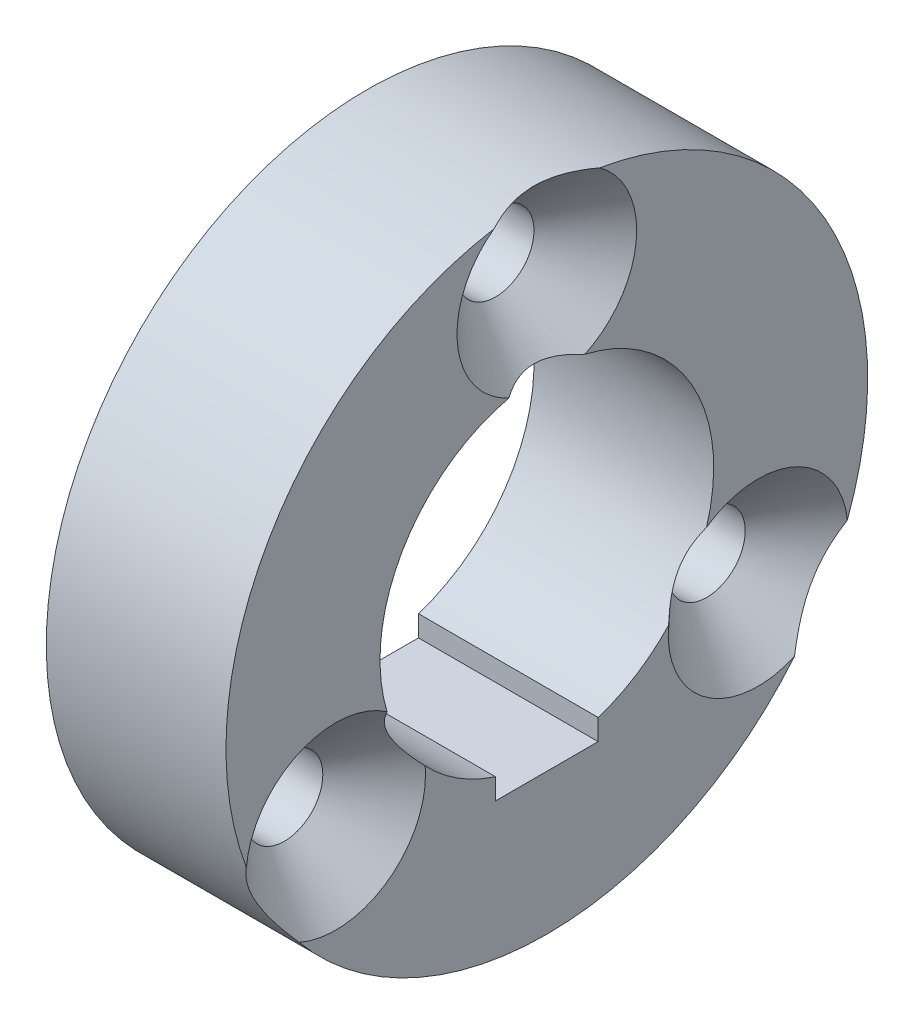
ISO-10303-21;
HEADER;
FILE_DESCRIPTION(('STEP AP214'),'2;1');
FILE_NAME('part.step','',(''),(''),'','','');
FILE_SCHEMA(('AUTOMOTIVE_DESIGN { 1 0 10303 214 1 1 1 1 }'));
ENDSEC;
DATA;
#1=APPLICATION_CONTEXT('core data for automotive mechanical design processes');
#2=APPLICATION_PROTOCOL_DEFINITION('international standard','automotive_design',2000,#1);
#3=PRODUCT_CONTEXT('',#1,'mechanical');
#4=PRODUCT('Part','Part','',(#3));
#5=PRODUCT_RELATED_PRODUCT_CATEGORY('part','',(#4));
#6=PRODUCT_DEFINITION_FORMATION('','',#4);
#7=PRODUCT_DEFINITION_CONTEXT('part definition',#1,'design');
#8=PRODUCT_DEFINITION('design','',#6,#7);
#9=PRODUCT_DEFINITION_SHAPE('','',#8);
#10=(LENGTH_UNIT() NAMED_UNIT(*) SI_UNIT(.MILLI.,.METRE.));
#11=(NAMED_UNIT(*) PLANE_ANGLE_UNIT() SI_UNIT($,.RADIAN.));
#12=(NAMED_UNIT(*) SI_UNIT($,.STERADIAN.) SOLID_ANGLE_UNIT());
#13=UNCERTAINTY_MEASURE_WITH_UNIT(LENGTH_MEASURE(1.E-05),#10,'distance_accuracy_value','');
#14=(GEOMETRIC_REPRESENTATION_CONTEXT(3) GLOBAL_UNCERTAINTY_ASSIGNED_CONTEXT((#13)) GLOBAL_UNIT_ASSIGNED_CONTEXT((#10,
#11,#12)) REPRESENTATION_CONTEXT('',''));
#15=CARTESIAN_POINT('',(0.,0.,0.));
#16=DIRECTION('',(0.,0.,1.));
#17=DIRECTION('',(1.,0.,0.));
#18=AXIS2_PLACEMENT_3D('',#15,#16,#17);
#19=CARTESIAN_POINT('',(7.,0.,0.));
#20=DIRECTION('',(1.,0.,0.));
#21=DIRECTION('',(0.,0.,-1.));
#22=AXIS2_PLACEMENT_3D('',#19,#20,#21);
#23=PLANE('',#22);
#24=CARTESIAN_POINT('',(7.,0.,0.));
#25=DIRECTION('',(1.,0.,0.));
#26=DIRECTION('',(0.,0.,-1.));
#27=AXIS2_PLACEMENT_3D('',#24,#25,#26);
#28=CIRCLE('',#27,6.5);
#29=CARTESIAN_POINT('',(7.,-1.8815789473684,-6.22170882192505));
#30=VERTEX_POINT('',#29);
#31=CARTESIAN_POINT('',(7.,6.32894736842105,-1.48135924331551));
#32=VERTEX_POINT('',#31);
#33=EDGE_CURVE('E156',#30,#32,#28,.T.);
#34=ORIENTED_EDGE('',*,*,#33,.F.);
#35=CARTESIAN_POINT('',(7.,-4.75,-8.22724133595217));
#36=DIRECTION('',(1.,0.,0.));
#37=DIRECTION('',(0.,0.,-1.));
#38=AXIS2_PLACEMENT_3D('',#35,#36,#37);
#39=CIRCLE('',#38,3.50000000000001);
#40=CARTESIAN_POINT('',(7.,-4.37973488258497,-11.7076010505256));
#41=VERTEX_POINT('',#40);
#42=EDGE_CURVE('E188',#30,#41,#39,.F.);
#43=ORIENTED_EDGE('',*,*,#42,.T.);
#44=CARTESIAN_POINT('',(7.,0.,0.));
#45=DIRECTION('',(1.,0.,0.));
#46=DIRECTION('',(0.,0.,-1.));
#47=AXIS2_PLACEMENT_3D('',#44,#45,#46);
#48=CIRCLE('',#47,12.5);
#49=CARTESIAN_POINT('',(7.,12.328947368421,-2.06083885510337));
#50=VERTEX_POINT('',#49);
#51=EDGE_CURVE('E164',#41,#50,#48,.T.);
#52=ORIENTED_EDGE('',*,*,#51,.T.);
#53=CARTESIAN_POINT('',(7.,9.5,0.));
#54=DIRECTION('',(1.,0.,0.));
#55=DIRECTION('',(0.,0.,-1.));
#56=AXIS2_PLACEMENT_3D('',#53,#54,#55);
#57=CIRCLE('',#56,3.50000000000001);
#58=EDGE_CURVE('E177',#50,#32,#57,.F.);
#59=ORIENTED_EDGE('',*,*,#58,.T.);
#60=EDGE_LOOP('',(#34,#43,#52,#59));
#61=FACE_BOUND('',#60,.T.);
#62=ADVANCED_FACE('F39',(#61),#23,.T.);
#63=DIRECTION('',(0.,-1.,0.));
#64=VECTOR('',#63,1.);
#65=CARTESIAN_POINT('',(7.,0.,2.));
#66=LINE('',#65,#64);
#67=CARTESIAN_POINT('',(7.,-6.18465843842649,2.));
#68=VERTEX_POINT('',#67);
#69=CARTESIAN_POINT('',(7.,-7.,2.));
#70=VERTEX_POINT('',#69);
#71=EDGE_CURVE('E143',#68,#70,#66,.T.);
#72=ORIENTED_EDGE('',*,*,#71,.F.);
#73=CARTESIAN_POINT('',(7.,-4.44736842105265,4.74034957860954));
#74=VERTEX_POINT('',#73);
#75=EDGE_CURVE('E289',#74,#68,#28,.T.);
#76=ORIENTED_EDGE('',*,*,#75,.F.);
#77=CARTESIAN_POINT('',(7.,-4.75,8.22724133595217));
#78=DIRECTION('',(1.,0.,0.));
#79=DIRECTION('',(0.,0.,-1.));
#80=AXIS2_PLACEMENT_3D('',#77,#78,#79);
#81=CIRCLE('',#80,3.50000000000002);
#82=CARTESIAN_POINT('',(7.,-7.94921248583608,9.64676219542225));
#83=VERTEX_POINT('',#82);
#84=EDGE_CURVE('E182',#74,#83,#81,.F.);
#85=ORIENTED_EDGE('',*,*,#84,.T.);
#86=CARTESIAN_POINT('',(7.,-7.94921248583607,-9.64676219542225));
#87=VERTEX_POINT('',#86);
#88=EDGE_CURVE('E167',#83,#87,#48,.T.);
#89=ORIENTED_EDGE('',*,*,#88,.T.);
#90=CARTESIAN_POINT('',(7.,-4.75,-8.22724133595217));
#91=DIRECTION('',(1.,0.,0.));
#92=DIRECTION('',(0.,0.,-1.));
#93=AXIS2_PLACEMENT_3D('',#90,#91,#92);
#94=CIRCLE('',#93,3.50000000000001);
#95=CARTESIAN_POINT('',(7.,-4.44736842105265,-4.74034957860954));
#96=VERTEX_POINT('',#95);
#97=EDGE_CURVE('E185',#87,#96,#94,.F.);
#98=ORIENTED_EDGE('',*,*,#97,.T.);
#99=CARTESIAN_POINT('',(7.,-6.18465843842649,-2.));
#100=VERTEX_POINT('',#99);
#101=EDGE_CURVE('E160',#100,#96,#28,.T.);
#102=ORIENTED_EDGE('',*,*,#101,.F.);
#103=DIRECTION('',(0.,1.,0.));
#104=VECTOR('',#103,1.);
#105=CARTESIAN_POINT('',(7.,0.,-2.));
#106=LINE('',#105,#104);
#107=CARTESIAN_POINT('',(7.,-7.,-2.));
#108=VERTEX_POINT('',#107);
#109=EDGE_CURVE('E55',#108,#100,#106,.T.);
#110=ORIENTED_EDGE('',*,*,#109,.F.);
#111=DIRECTION('',(0.,0.,-1.));
#112=VECTOR('',#111,1.);
#113=CARTESIAN_POINT('',(7.,-7.,0.));
#114=LINE('',#113,#112);
#115=EDGE_CURVE('E125',#70,#108,#114,.T.);
#116=ORIENTED_EDGE('',*,*,#115,.F.);
#117=EDGE_LOOP('',(#72,#76,#85,#89,#98,#102,#110,#116));
#118=FACE_BOUND('',#117,.T.);
#119=ADVANCED_FACE('F263',(#118),#23,.T.);
#120=CARTESIAN_POINT('',(7.,12.328947368421,2.06083885510337));
#121=VERTEX_POINT('',#120);
#122=CARTESIAN_POINT('',(7.,-4.37973488258497,11.7076010505256));
#123=VERTEX_POINT('',#122);
#124=EDGE_CURVE('E169',#121,#123,#48,.T.);
#125=ORIENTED_EDGE('',*,*,#124,.T.);
#126=CARTESIAN_POINT('',(7.,-4.75,8.22724133595217));
#127=DIRECTION('',(1.,0.,0.));
#128=DIRECTION('',(0.,0.,-1.));
#129=AXIS2_PLACEMENT_3D('',#126,#127,#128);
#130=CIRCLE('',#129,3.50000000000002);
#131=CARTESIAN_POINT('',(7.,-1.88157894736839,6.22170882192506));
#132=VERTEX_POINT('',#131);
#133=EDGE_CURVE('E180',#123,#132,#130,.F.);
#134=ORIENTED_EDGE('',*,*,#133,.T.);
#135=CARTESIAN_POINT('',(7.,6.32894736842105,1.48135924331551));
#136=VERTEX_POINT('',#135);
#137=EDGE_CURVE('E161',#136,#132,#28,.T.);
#138=ORIENTED_EDGE('',*,*,#137,.F.);
#139=CARTESIAN_POINT('',(7.,9.5,0.));
#140=DIRECTION('',(1.,0.,0.));
#141=DIRECTION('',(0.,0.,-1.));
#142=AXIS2_PLACEMENT_3D('',#139,#140,#141);
#143=CIRCLE('',#142,3.50000000000001);
#144=EDGE_CURVE('E175',#136,#121,#143,.F.);
#145=ORIENTED_EDGE('',*,*,#144,.T.);
#146=EDGE_LOOP('',(#125,#134,#138,#145));
#147=FACE_BOUND('',#146,.T.);
#148=ADVANCED_FACE('F234',(#147),#23,.T.);
#149=CARTESIAN_POINT('',(0.,0.,0.));
#150=DIRECTION('',(1.,0.,0.));
#151=DIRECTION('',(0.,0.,-1.));
#152=AXIS2_PLACEMENT_3D('',#149,#150,#151);
#153=PLANE('',#152);
#154=CARTESIAN_POINT('',(0.,0.,0.));
#155=DIRECTION('',(1.,0.,0.));
#156=DIRECTION('',(0.,0.,-1.));
#157=AXIS2_PLACEMENT_3D('',#154,#155,#156);
#158=CIRCLE('',#157,12.5);
#159=CARTESIAN_POINT('',(0.,0.,-12.5));
#160=VERTEX_POINT('',#159);
#161=EDGE_CURVE('E168',#160,#160,#158,.T.);
#162=ORIENTED_EDGE('',*,*,#161,.F.);
#163=EDGE_LOOP('',(#162));
#164=FACE_BOUND('',#163,.T.);
#165=CARTESIAN_POINT('',(0.,0.,0.));
#166=DIRECTION('',(1.,0.,0.));
#167=DIRECTION('',(0.,0.,-1.));
#168=AXIS2_PLACEMENT_3D('',#165,#166,#167);
#169=CIRCLE('',#168,6.5);
#170=CARTESIAN_POINT('',(0.,-6.18465843842649,-2.));
#171=VERTEX_POINT('',#170);
#172=CARTESIAN_POINT('',(0.,-6.18465843842649,2.));
#173=VERTEX_POINT('',#172);
#174=EDGE_CURVE('E155',#171,#173,#169,.T.);
#175=ORIENTED_EDGE('',*,*,#174,.T.);
#176=DIRECTION('',(0.,1.,0.));
#177=VECTOR('',#176,1.);
#178=CARTESIAN_POINT('',(0.,-3.,2.));
#179=LINE('',#178,#177);
#180=CARTESIAN_POINT('',(0.,-7.,2.));
#181=VERTEX_POINT('',#180);
#182=EDGE_CURVE('E127',#181,#173,#179,.T.);
#183=ORIENTED_EDGE('',*,*,#182,.F.);
#184=DIRECTION('',(0.,0.,1.));
#185=VECTOR('',#184,1.);
#186=CARTESIAN_POINT('',(0.,-7.,-2.));
#187=LINE('',#186,#185);
#188=CARTESIAN_POINT('',(0.,-7.,-2.));
#189=VERTEX_POINT('',#188);
#190=EDGE_CURVE('E122',#189,#181,#187,.T.);
#191=ORIENTED_EDGE('',*,*,#190,.F.);
#192=DIRECTION('',(0.,-1.,0.));
#193=VECTOR('',#192,1.);
#194=CARTESIAN_POINT('',(0.,-3.,-2.));
#195=LINE('',#194,#193);
#196=EDGE_CURVE('E130',#171,#189,#195,.T.);
#197=ORIENTED_EDGE('',*,*,#196,.F.);
#198=EDGE_LOOP('',(#175,#183,#191,#197));
#199=FACE_BOUND('',#198,.T.);
#200=CARTESIAN_POINT('',(0.,9.5,0.));
#201=DIRECTION('',(1.,0.,0.));
#202=DIRECTION('',(0.,0.,-1.));
#203=AXIS2_PLACEMENT_3D('',#200,#201,#202);
#204=CIRCLE('',#203,1.5);
#205=CARTESIAN_POINT('',(0.,9.5,-1.5));
#206=VERTEX_POINT('',#205);
#207=EDGE_CURVE('E152',#206,#206,#204,.T.);
#208=ORIENTED_EDGE('',*,*,#207,.T.);
#209=EDGE_LOOP('',(#208));
#210=FACE_BOUND('',#209,.T.);
#211=CARTESIAN_POINT('',(0.,-4.75,8.22724133595217));
#212=DIRECTION('',(1.,0.,0.));
#213=DIRECTION('',(0.,0.,-1.));
#214=AXIS2_PLACEMENT_3D('',#211,#212,#213);
#215=CIRCLE('',#214,1.5);
#216=CARTESIAN_POINT('',(0.,-4.75,6.72724133595217));
#217=VERTEX_POINT('',#216);
#218=EDGE_CURVE('E149',#217,#217,#215,.T.);
#219=ORIENTED_EDGE('',*,*,#218,.T.);
#220=EDGE_LOOP('',(#219));
#221=FACE_BOUND('',#220,.T.);
#222=CARTESIAN_POINT('',(0.,-4.75,-8.22724133595217));
#223=DIRECTION('',(1.,0.,0.));
#224=DIRECTION('',(0.,0.,-1.));
#225=AXIS2_PLACEMENT_3D('',#222,#223,#224);
#226=CIRCLE('',#225,1.5);
#227=CARTESIAN_POINT('',(0.,-4.75,-9.72724133595217));
#228=VERTEX_POINT('',#227);
#229=EDGE_CURVE('E146',#228,#228,#226,.T.);
#230=ORIENTED_EDGE('',*,*,#229,.T.);
#231=EDGE_LOOP('',(#230));
#232=FACE_BOUND('',#231,.T.);
#233=ADVANCED_FACE('F136',(#164,#199,#210,#221,#232),#153,.F.);
#234=CARTESIAN_POINT('',(7.,0.,0.));
#235=DIRECTION('',(-1.,0.,0.));
#236=DIRECTION('',(0.,0.,1.));
#237=AXIS2_PLACEMENT_3D('',#234,#235,#236);
#238=CYLINDRICAL_SURFACE('',#237,12.5);
#239=ORIENTED_EDGE('',*,*,#51,.F.);
#240=CARTESIAN_POINT('',(7.,-4.37973488258497,-11.7076010505256));
#241=CARTESIAN_POINT('',(6.94402610435837,-4.49696011355142,-11.6637454118113));
#242=CARTESIAN_POINT('',(6.89101736980698,-4.61489522332693,-11.6176217081313));
#243=CARTESIAN_POINT('',(6.79265023440408,-4.85240126134884,-11.5204485997706));
#244=CARTESIAN_POINT('',(6.74731666823778,-4.97197619562667,-11.4693840148462));
#245=CARTESIAN_POINT('',(6.66666835059121,-5.21143276811812,-11.3625712856021));
#246=CARTESIAN_POINT('',(6.63128900958349,-5.33130708505739,-11.3068565275998));
#247=CARTESIAN_POINT('',(6.57224502834808,-5.5714188387032,-11.1904892604553));
#248=CARTESIAN_POINT('',(6.54856586406106,-5.69165563785338,-11.1298429825946));
#249=CARTESIAN_POINT('',(6.51751440808375,-5.91077342579347,-11.0147768696683));
#250=CARTESIAN_POINT('',(6.50802728485306,-6.00974430728038,-10.9610993828311));
#251=CARTESIAN_POINT('',(6.49871454373939,-6.20656205282013,-10.8508665742969));
#252=CARTESIAN_POINT('',(6.49889018333019,-6.30440876892132,-10.7943108789979));
#253=CARTESIAN_POINT('',(6.50890069573585,-6.49819539405028,-10.6787728923357));
#254=CARTESIAN_POINT('',(6.51873921124259,-6.59413457006175,-10.6197896938913));
#255=CARTESIAN_POINT('',(6.54751791240363,-6.78339111652575,-10.4999121625446));
#256=CARTESIAN_POINT('',(6.56645773595913,-6.87670859112728,-10.4390179057646));
#257=CARTESIAN_POINT('',(6.61143260364709,-7.05608937713771,-10.3185630122533));
#258=CARTESIAN_POINT('',(6.63710472061681,-7.14228943742344,-10.2590681846741));
#259=CARTESIAN_POINT('',(6.69489848507189,-7.31174457175367,-10.1389930188761));
#260=CARTESIAN_POINT('',(6.72702227732709,-7.3949986555951,-10.0784123257922));
#261=CARTESIAN_POINT('',(6.79671790960225,-7.55848665874227,-9.95638931914586));
#262=CARTESIAN_POINT('',(6.83428877862371,-7.63872111312447,-9.8949471609082));
#263=CARTESIAN_POINT('',(6.91396029026199,-7.79617512830939,-9.77136866236953));
#264=CARTESIAN_POINT('',(6.95605512557377,-7.87339838490583,-9.70923330165754));
#265=CARTESIAN_POINT('',(7.,-7.94921248583607,-9.64676219542225));
#266=B_SPLINE_CURVE_WITH_KNOTS('',3,(#240,#241,#242,#243,#244,#245,#246,#247,#248,#249,#250,
#251,#252,#253,#254,#255,#256,#257,#258,#259,#260,#261,#262,#263,#264,#265),.UNSPECIFIED.,.F.,
.F.,(4,2,2,2,2,2,2,2,2,2,2,2,4),(0.,0.411451654137317,0.824210208934069,1.2342252706468,
1.64373007182267,1.98226747579355,2.32084893578913,2.65955808256544,2.9982537547927,
3.32150481250254,3.64486350894121,3.96816463401607,4.29105559343916),.UNSPECIFIED.);
#267=EDGE_CURVE('E63',#41,#87,#266,.T.);
#268=ORIENTED_EDGE('',*,*,#267,.T.);
#269=ORIENTED_EDGE('',*,*,#88,.F.);
#270=CARTESIAN_POINT('',(7.,-7.94921248583608,9.64676219542225));
#271=CARTESIAN_POINT('',(6.94402610435837,-7.85261977312705,9.72635440404652));
#272=CARTESIAN_POINT('',(6.89101736980698,-7.75370791913581,9.80542735327023));
#273=CARTESIAN_POINT('',(6.79265023440408,-7.55080051971982,9.96252706156907));
#274=CARTESIAN_POINT('',(6.74731666823778,-7.44678982480267,10.0405496998473));
#275=CARTESIAN_POINT('',(6.66666835059121,-7.23455900158399,10.194518810106));
#276=CARTESIAN_POINT('',(6.63128900958348,-7.12637144731869,10.2704756348356));
#277=CARTESIAN_POINT('',(6.57224502834808,-6.90553856097967,10.4202348796678));
#278=CARTESIAN_POINT('',(6.54856586406105,-6.7928989441322,10.4940398632712));
#279=CARTESIAN_POINT('',(6.51751440808374,-6.5836898732533,10.6262683775853));
#280=CARTESIAN_POINT('',(6.50802728485306,-6.48771836529753,10.6851409317693));
#281=CARTESIAN_POINT('',(6.49871454373939,-6.29384508000645,10.8004736950551));
#282=CARTESIAN_POINT('',(6.49889018333019,-6.19594305309824,10.8569335892262));
#283=CARTESIAN_POINT('',(6.50890069573584,-5.99899090898219,10.9669887361704));
#284=CARTESIAN_POINT('',(6.51873921124258,-5.89994037272714,11.0205829005923));
#285=CARTESIAN_POINT('',(6.54751791240362,-5.70149511200601,11.1245451119893));
#286=CARTESIAN_POINT('',(6.56645773595911,-5.6021004013892,11.1749132872212));
#287=CARTESIAN_POINT('',(6.61143260364707,-5.40809301059301,11.2700341581014));
#288=CARTESIAN_POINT('',(6.6371047206168,-5.31346894837276,11.314938186327));
#289=CARTESIAN_POINT('',(6.69489848507188,-5.124753237263,11.4016530545597));
#290=CARTESIAN_POINT('',(6.72702227732707,-5.03066177615275,11.4434628595932));
#291=CARTESIAN_POINT('',(6.79671790960224,-4.84324275097724,11.5240361202095));
#292=CARTESIAN_POINT('',(6.8342887786237,-4.74991505388898,11.5628001168444));
#293=CARTESIAN_POINT('',(6.91396029026199,-4.56416592720049,11.6373700446531));
#294=CARTESIAN_POINT('',(6.95605512557377,-4.47174349805237,11.6731796662726));
#295=CARTESIAN_POINT('',(7.,-4.37973488258497,11.7076010505256));
#296=B_SPLINE_CURVE_WITH_KNOTS('',3,(#270,#271,#272,#273,#274,#275,#276,#277,#278,#279,#280,
#281,#282,#283,#284,#285,#286,#287,#288,#289,#290,#291,#292,#293,#294,#295),.UNSPECIFIED.,.F.,
.F.,(4,2,2,2,2,2,2,2,2,2,2,2,4),(0.,0.411451654137314,0.824210208934063,1.23422527064679,
1.64373007182266,1.98226747579354,2.32084893578911,2.65955808256541,2.99825375479267,
3.32150481250252,3.6448635089412,3.96816463401607,4.29105559343918),.UNSPECIFIED.);
#297=EDGE_CURVE('E196',#83,#123,#296,.T.);
#298=ORIENTED_EDGE('',*,*,#297,.T.);
#299=ORIENTED_EDGE('',*,*,#124,.F.);
#300=CARTESIAN_POINT('',(7.,12.328947368421,2.06083885510337));
#301=CARTESIAN_POINT('',(6.94402610435837,12.3495798866785,1.93739100776476));
#302=CARTESIAN_POINT('',(6.89101736980699,12.3686031424627,1.81219435486107));
#303=CARTESIAN_POINT('',(6.79265023440409,12.4032017810687,1.55792153820157));
#304=CARTESIAN_POINT('',(6.74731666823778,12.4187660204293,1.42883431499892));
#305=CARTESIAN_POINT('',(6.66666835059121,12.4459917697021,1.16805247549611));
#306=CARTESIAN_POINT('',(6.63128900958349,12.4576785323761,1.03638089276426));
#307=CARTESIAN_POINT('',(6.57224502834808,12.4769573996829,0.770254380787507));
#308=CARTESIAN_POINT('',(6.54856586406106,12.4845545819856,0.635803119323351));
#309=CARTESIAN_POINT('',(6.51751440808375,12.4944632990468,0.388508492083053));
#310=CARTESIAN_POINT('',(6.50802728485306,12.4974626725779,0.275958451061856));
#311=CARTESIAN_POINT('',(6.49871454373939,12.5004071328266,0.050392879241702));
#312=CARTESIAN_POINT('',(6.4988901833302,12.5003518220195,-0.062622710228312));
#313=CARTESIAN_POINT('',(6.50890069573585,12.4971863030325,-0.288215843834738));
#314=CARTESIAN_POINT('',(6.51873921124259,12.4940749427889,-0.400793206701021));
#315=CARTESIAN_POINT('',(6.54751791240363,12.4848862285317,-0.624632949444664));
#316=CARTESIAN_POINT('',(6.56645773595912,12.4788089925165,-0.735895381456596));
#317=CARTESIAN_POINT('',(6.61143260364709,12.4641823877307,-0.951471145848125));
#318=CARTESIAN_POINT('',(6.63710472061681,12.4557583857962,-1.05587000165292));
#319=CARTESIAN_POINT('',(6.6948984850719,12.4364978090166,-1.26266003568358));
#320=CARTESIAN_POINT('',(6.72702227732708,12.4256604317478,-1.36505053380101));
#321=CARTESIAN_POINT('',(6.79671790960225,12.4017294097195,-1.56764680106364));
#322=CARTESIAN_POINT('',(6.83428877862371,12.3886361670134,-1.66785295593624));
#323=CARTESIAN_POINT('',(6.91396029026199,12.3603410555099,-1.86600138228357));
#324=CARTESIAN_POINT('',(6.95605512557377,12.3451418829582,-1.96394636461505));
#325=CARTESIAN_POINT('',(7.,12.328947368421,-2.06083885510337));
#326=B_SPLINE_CURVE_WITH_KNOTS('',3,(#300,#301,#302,#303,#304,#305,#306,#307,#308,#309,#310,
#311,#312,#313,#314,#315,#316,#317,#318,#319,#320,#321,#322,#323,#324,#325),.UNSPECIFIED.,.F.,
.F.,(4,2,2,2,2,2,2,2,2,2,2,2,4),(0.,0.411451654137316,0.824210208934068,1.2342252706468,
1.64373007182267,1.98226747579355,2.32084893578913,2.65955808256544,2.9982537547927,
3.32150481250255,3.64486350894122,3.96816463401608,4.29105559343917),.UNSPECIFIED.);
#327=EDGE_CURVE('E190',#121,#50,#326,.T.);
#328=ORIENTED_EDGE('',*,*,#327,.T.);
#329=EDGE_LOOP('',(#239,#268,#269,#298,#299,#328));
#330=FACE_BOUND('',#329,.T.);
#331=ORIENTED_EDGE('',*,*,#161,.T.);
#332=EDGE_LOOP('',(#331));
#333=FACE_BOUND('',#332,.T.);
#334=ADVANCED_FACE('F201',(#330,#333),#238,.T.);
#335=CARTESIAN_POINT('',(7.,0.,0.));
#336=DIRECTION('',(-1.,0.,0.));
#337=DIRECTION('',(0.,0.,1.));
#338=AXIS2_PLACEMENT_3D('',#335,#336,#337);
#339=CYLINDRICAL_SURFACE('',#338,6.5);
#340=DIRECTION('',(-1.,0.,0.));
#341=VECTOR('',#340,1.);
#342=CARTESIAN_POINT('',(7.,-6.18465843842649,2.));
#343=LINE('',#342,#341);
#344=EDGE_CURVE('E11',#173,#68,#343,.F.);
#345=ORIENTED_EDGE('',*,*,#344,.F.);
#346=ORIENTED_EDGE('',*,*,#174,.F.);
#347=DIRECTION('',(-1.,0.,0.));
#348=VECTOR('',#347,1.);
#349=CARTESIAN_POINT('',(7.,-6.18465843842649,-2.));
#350=LINE('',#349,#348);
#351=EDGE_CURVE('E48',#100,#171,#350,.T.);
#352=ORIENTED_EDGE('',*,*,#351,.F.);
#353=ORIENTED_EDGE('',*,*,#101,.T.);
#354=CARTESIAN_POINT('',(7.,-4.44736842105265,-4.74034957860954));
#355=CARTESIAN_POINT('',(6.95490154530159,-4.39414731719357,-4.79027113308305));
#356=CARTESIAN_POINT('',(6.9114265802054,-4.33930143790359,-4.84005153940568));
#357=CARTESIAN_POINT('',(6.82871607663131,-4.22583864432225,-4.93943595806448));
#358=CARTESIAN_POINT('',(6.78949902392607,-4.16720692153831,-4.98903836260085));
#359=CARTESIAN_POINT('',(6.71615459681228,-4.04519460401465,-5.08848425507695));
#360=CARTESIAN_POINT('',(6.68211117164536,-3.98175655328574,-5.13832043987649));
#361=CARTESIAN_POINT('',(6.62146363391542,-3.85091826293526,-5.23709305629144));
#362=CARTESIAN_POINT('',(6.5948469514909,-3.78352495458845,-5.28603087559588));
#363=CARTESIAN_POINT('',(6.54330184357738,-3.6215505063278,-5.398801037087));
#364=CARTESIAN_POINT('',(6.52192424212649,-3.52542300140014,-5.46213264666797));
#365=CARTESIAN_POINT('',(6.49881446094593,-3.32892272954889,-5.58404071132375));
#366=CARTESIAN_POINT('',(6.4969253893859,-3.22859040576134,-5.6426513667946));
#367=CARTESIAN_POINT('',(6.5127067929047,-3.02625952836005,-5.75370121977957));
#368=CARTESIAN_POINT('',(6.53035930840266,-2.92426258941902,-5.8061460350077));
#369=CARTESIAN_POINT('',(6.5825512779758,-2.72056584722308,-5.90435836654974));
#370=CARTESIAN_POINT('',(6.61721955752887,-2.61887436163339,-5.95007142907994));
#371=CARTESIAN_POINT('',(6.70334925610523,-2.40833364921283,-6.03856038383999));
#372=CARTESIAN_POINT('',(6.75610123115625,-2.29973193335721,-6.08063541904657));
#373=CARTESIAN_POINT('',(6.8428567543265,-2.14014590558235,-6.13782603125829));
#374=CARTESIAN_POINT('',(6.87280088790586,-2.08787312640743,-6.15579243618989));
#375=CARTESIAN_POINT('',(6.93486305043999,-1.9841460482156,-6.19000279416422));
#376=CARTESIAN_POINT('',(6.96697848088884,-1.93269085877428,-6.20624874840717));
#377=CARTESIAN_POINT('',(7.,-1.8815789473684,-6.22170882192505));
#378=B_SPLINE_CURVE_WITH_KNOTS('',3,(#354,#355,#356,#357,#358,#359,#360,#361,#362,#363,#364,
#365,#366,#367,#368,#369,#370,#371,#372,#373,#374,#375,#376,#377),.UNSPECIFIED.,.F.,.F.,(4,2,2,
2,2,2,2,2,2,2,2,4),(0.,0.257422245104053,0.515920814810127,0.778246482559693,1.04012542957077,
1.38970968435598,1.73647740400711,2.08292669320602,2.43204036136927,2.81459727054188,
3.00314251176194,3.1914659739658),.UNSPECIFIED.);
#379=EDGE_CURVE('E237',#96,#30,#378,.T.);
#380=ORIENTED_EDGE('',*,*,#379,.T.);
#381=ORIENTED_EDGE('',*,*,#33,.T.);
#382=CARTESIAN_POINT('',(7.,6.32894736842105,-1.48135924331551));
#383=CARTESIAN_POINT('',(6.95490154530159,6.34557015086198,-1.41030763811934));
#384=CARTESIAN_POINT('',(6.9114265802054,6.36125830770309,-1.3379195102));
#385=CARTESIAN_POINT('',(6.82871607663131,6.39059634221129,-1.18996563924482));
#386=CARTESIAN_POINT('',(6.78949902392607,6.40423742323661,-1.11438787557809));
#387=CARTESIAN_POINT('',(6.71615459681229,6.4293539336611,-0.958999162789941));
#388=CARTESIAN_POINT('',(6.68211117164536,6.44079431036074,-0.879142106892365));
#389=CARTESIAN_POINT('',(6.62146363391542,6.46091476019911,-0.716446515453655));
#390=CARTESIAN_POINT('',(6.5948469514909,6.46959950074916,-0.633613288728025));
#391=CARTESIAN_POINT('',(6.54330184357738,6.48627410125902,-0.436954221024768));
#392=CARTESIAN_POINT('',(6.52192424212649,6.49305713155486,-0.322039554964513));
#393=CARTESIAN_POINT('',(6.49881446094593,6.50038247654734,-0.090911295362895));
#394=CARTESIAN_POINT('',(6.4969253893859,6.50097463122378,0.02528437359327));
#395=CARTESIAN_POINT('',(6.5127067929047,6.49598118629465,0.256032979885275));
#396=CARTESIAN_POINT('',(6.53035930840266,6.49040125910847,0.37058732773052));
#397=CARTESIAN_POINT('',(6.5825512779758,6.47360726209081,0.596100046911351));
#398=CARTESIAN_POINT('',(6.61721955752887,6.4623501927319,0.7070239880457));
#399=CARTESIAN_POINT('',(6.70334925610524,6.43371351929815,0.933602070912807));
#400=CARTESIAN_POINT('',(6.75610123115625,6.41585071072437,1.04869143334164));
#401=CARTESIAN_POINT('',(6.8428567543265,6.38558621987028,1.21549229358957));
#402=CARTESIAN_POINT('',(6.87280088790586,6.37500919336826,1.26974505074727));
#403=CARTESIAN_POINT('',(6.93486305043999,6.35277269335068,1.37668051450889));
#404=CARTESIAN_POINT('',(6.96697848088883,6.34111450771313,1.42936499284309));
#405=CARTESIAN_POINT('',(7.,6.32894736842105,1.48135924331551));
#406=B_SPLINE_CURVE_WITH_KNOTS('',3,(#382,#383,#384,#385,#386,#387,#388,#389,#390,#391,#392,
#393,#394,#395,#396,#397,#398,#399,#400,#401,#402,#403,#404,#405),.UNSPECIFIED.,.F.,.F.,(4,2,2,
2,2,2,2,2,2,2,2,4),(0.,0.257422245104053,0.515920814810127,0.778246482559693,1.04012542957077,
1.38970968435598,1.73647740400711,2.08292669320602,2.43204036136927,2.81459727054187,
3.00314251176193,3.19146597396579),.UNSPECIFIED.);
#407=EDGE_CURVE('E217',#32,#136,#406,.T.);
#408=ORIENTED_EDGE('',*,*,#407,.T.);
#409=ORIENTED_EDGE('',*,*,#137,.T.);
#410=CARTESIAN_POINT('',(7.,-1.88157894736839,6.22170882192506));
#411=CARTESIAN_POINT('',(6.95490154530159,-1.9514228336684,6.2005787712024));
#412=CARTESIAN_POINT('',(6.9114265802054,-2.0219568697995,6.17797104960569));
#413=CARTESIAN_POINT('',(6.8287160766313,-2.16475769788904,6.1294015973093));
#414=CARTESIAN_POINT('',(6.78949902392606,-2.2370305016983,6.10342623817895));
#415=CARTESIAN_POINT('',(6.71615459681228,-2.38415932964645,6.0474834178669));
#416=CARTESIAN_POINT('',(6.68211117164536,-2.459037757075,6.01746254676886));
#417=CARTESIAN_POINT('',(6.62146363391542,-2.60999649726384,5.9535395717451));
#418=CARTESIAN_POINT('',(6.5948469514909,-2.6860745461607,5.91964416432391));
#419=CARTESIAN_POINT('',(6.54330184357737,-2.86472359493121,5.83575525811178));
#420=CARTESIAN_POINT('',(6.52192424212648,-2.96763413015472,5.78417220163249));
#421=CARTESIAN_POINT('',(6.49881446094592,-3.17145974699844,5.67495200668665));
#422=CARTESIAN_POINT('',(6.49692538938589,-3.27238422546242,5.61736699320134));
#423=CARTESIAN_POINT('',(6.51270679290469,-3.46972165793459,5.49766823989431));
#424=CARTESIAN_POINT('',(6.53035930840265,-3.56613866968944,5.43555870727719));
#425=CARTESIAN_POINT('',(6.58255127797579,-3.75304141486771,5.3082583196384));
#426=CARTESIAN_POINT('',(6.61721955752885,-3.84347583109849,5.24304744103425));
#427=CARTESIAN_POINT('',(6.70334925610522,-4.02537987008531,5.10495831292719));
#428=CARTESIAN_POINT('',(6.75610123115624,-4.11611877736715,5.03194398570494));
#429=CARTESIAN_POINT('',(6.84285675432649,-4.24544031428792,4.92233373766872));
#430=CARTESIAN_POINT('',(6.87280088790586,-4.28713606696082,4.88604738544262));
#431=CARTESIAN_POINT('',(6.93486305043999,-4.36862664513507,4.81332227965533));
#432=CARTESIAN_POINT('',(6.96697848088883,-4.40842364893884,4.77688375556408));
#433=CARTESIAN_POINT('',(7.,-4.44736842105265,4.74034957860954));
#434=B_SPLINE_CURVE_WITH_KNOTS('',3,(#410,#411,#412,#413,#414,#415,#416,#417,#418,#419,#420,
#421,#422,#423,#424,#425,#426,#427,#428,#429,#430,#431,#432,#433),.UNSPECIFIED.,.F.,.F.,(4,2,2,
2,2,2,2,2,2,2,2,4),(0.,0.257422245104054,0.515920814810128,0.778246482559696,1.04012542957077,
1.38970968435598,1.73647740400711,2.08292669320601,2.43204036136926,2.81459727054187,
3.00314251176194,3.19146597396582),.UNSPECIFIED.);
#435=EDGE_CURVE('E223',#132,#74,#434,.T.);
#436=ORIENTED_EDGE('',*,*,#435,.T.);
#437=ORIENTED_EDGE('',*,*,#75,.T.);
#438=EDGE_LOOP('',(#345,#346,#352,#353,#380,#381,#408,#409,#436,#437));
#439=FACE_BOUND('',#438,.T.);
#440=ADVANCED_FACE('F206',(#439),#339,.F.);
#441=CARTESIAN_POINT('',(7.,9.5,0.));
#442=DIRECTION('',(-1.,0.,0.));
#443=DIRECTION('',(0.,0.,1.));
#444=AXIS2_PLACEMENT_3D('',#441,#442,#443);
#445=CYLINDRICAL_SURFACE('',#444,1.5);
#446=CARTESIAN_POINT('',(5.,9.5,0.));
#447=DIRECTION('',(1.,0.,0.));
#448=DIRECTION('',(0.,0.,-1.));
#449=AXIS2_PLACEMENT_3D('',#446,#447,#448);
#450=CIRCLE('',#449,1.5);
#451=CARTESIAN_POINT('',(5.,9.5,-1.5));
#452=VERTEX_POINT('',#451);
#453=EDGE_CURVE('E245',#452,#452,#450,.T.);
#454=ORIENTED_EDGE('',*,*,#453,.T.);
#455=EDGE_LOOP('',(#454));
#456=FACE_BOUND('',#455,.T.);
#457=ORIENTED_EDGE('',*,*,#207,.F.);
#458=EDGE_LOOP('',(#457));
#459=FACE_BOUND('',#458,.T.);
#460=ADVANCED_FACE('F231',(#456,#459),#445,.F.);
#461=CARTESIAN_POINT('',(7.,-4.75,8.22724133595217));
#462=DIRECTION('',(-1.,0.,0.));
#463=DIRECTION('',(0.,0.,1.));
#464=AXIS2_PLACEMENT_3D('',#461,#462,#463);
#465=CYLINDRICAL_SURFACE('',#464,1.5);
#466=CARTESIAN_POINT('',(4.99999999999996,-4.75,8.22724133595217));
#467=DIRECTION('',(1.,0.,0.));
#468=DIRECTION('',(0.,0.,-1.));
#469=AXIS2_PLACEMENT_3D('',#466,#467,#468);
#470=CIRCLE('',#469,1.5);
#471=CARTESIAN_POINT('',(4.99999999999996,-4.75,6.72724133595217));
#472=VERTEX_POINT('',#471);
#473=EDGE_CURVE('E242',#472,#472,#470,.T.);
#474=ORIENTED_EDGE('',*,*,#473,.T.);
#475=EDGE_LOOP('',(#474));
#476=FACE_BOUND('',#475,.T.);
#477=ORIENTED_EDGE('',*,*,#218,.F.);
#478=EDGE_LOOP('',(#477));
#479=FACE_BOUND('',#478,.T.);
#480=ADVANCED_FACE('F306',(#476,#479),#465,.F.);
#481=CARTESIAN_POINT('',(7.,-4.75,-8.22724133595217));
#482=DIRECTION('',(-1.,0.,0.));
#483=DIRECTION('',(0.,0.,1.));
#484=AXIS2_PLACEMENT_3D('',#481,#482,#483);
#485=CYLINDRICAL_SURFACE('',#484,1.5);
#486=CARTESIAN_POINT('',(5.,-4.75,-8.22724133595217));
#487=DIRECTION('',(1.,0.,0.));
#488=DIRECTION('',(0.,0.,-1.));
#489=AXIS2_PLACEMENT_3D('',#486,#487,#488);
#490=CIRCLE('',#489,1.5);
#491=CARTESIAN_POINT('',(5.,-4.75,-9.72724133595217));
#492=VERTEX_POINT('',#491);
#493=EDGE_CURVE('E172',#492,#492,#490,.T.);
#494=ORIENTED_EDGE('',*,*,#493,.T.);
#495=EDGE_LOOP('',(#494));
#496=FACE_BOUND('',#495,.T.);
#497=ORIENTED_EDGE('',*,*,#229,.F.);
#498=EDGE_LOOP('',(#497));
#499=FACE_BOUND('',#498,.T.);
#500=ADVANCED_FACE('F301',(#496,#499),#485,.F.);
#501=CARTESIAN_POINT('',(5.,-4.75,-8.22724133595217));
#502=DIRECTION('',(1.,0.,0.));
#503=DIRECTION('',(0.,0.,-1.));
#504=AXIS2_PLACEMENT_3D('',#501,#502,#503);
#505=CONICAL_SURFACE('',#504,1.5,0.78539816339745);
#506=ORIENTED_EDGE('',*,*,#267,.F.);
#507=ORIENTED_EDGE('',*,*,#42,.F.);
#508=ORIENTED_EDGE('',*,*,#379,.F.);
#509=ORIENTED_EDGE('',*,*,#97,.F.);
#510=EDGE_LOOP('',(#506,#507,#508,#509));
#511=FACE_BOUND('',#510,.T.);
#512=ORIENTED_EDGE('',*,*,#493,.F.);
#513=EDGE_LOOP('',(#512));
#514=FACE_BOUND('',#513,.T.);
#515=ADVANCED_FACE('F209',(#511,#514),#505,.F.);
#516=CARTESIAN_POINT('',(4.99999999999996,-4.75,8.22724133595217));
#517=DIRECTION('',(1.,0.,0.));
#518=DIRECTION('',(0.,0.,-1.));
#519=AXIS2_PLACEMENT_3D('',#516,#517,#518);
#520=CONICAL_SURFACE('',#519,1.5,0.785398163397443);
#521=ORIENTED_EDGE('',*,*,#297,.F.);
#522=ORIENTED_EDGE('',*,*,#84,.F.);
#523=ORIENTED_EDGE('',*,*,#435,.F.);
#524=ORIENTED_EDGE('',*,*,#133,.F.);
#525=EDGE_LOOP('',(#521,#522,#523,#524));
#526=FACE_BOUND('',#525,.T.);
#527=ORIENTED_EDGE('',*,*,#473,.F.);
#528=EDGE_LOOP('',(#527));
#529=FACE_BOUND('',#528,.T.);
#530=ADVANCED_FACE('F253',(#526,#529),#520,.F.);
#531=CARTESIAN_POINT('',(5.,9.5,0.));
#532=DIRECTION('',(1.,0.,0.));
#533=DIRECTION('',(0.,0.,-1.));
#534=AXIS2_PLACEMENT_3D('',#531,#532,#533);
#535=CONICAL_SURFACE('',#534,1.5,0.785398163397451);
#536=ORIENTED_EDGE('',*,*,#407,.F.);
#537=ORIENTED_EDGE('',*,*,#58,.F.);
#538=ORIENTED_EDGE('',*,*,#327,.F.);
#539=ORIENTED_EDGE('',*,*,#144,.F.);
#540=EDGE_LOOP('',(#536,#537,#538,#539));
#541=FACE_BOUND('',#540,.T.);
#542=ORIENTED_EDGE('',*,*,#453,.F.);
#543=EDGE_LOOP('',(#542));
#544=FACE_BOUND('',#543,.T.);
#545=ADVANCED_FACE('F41',(#541,#544),#535,.F.);
#546=CARTESIAN_POINT('',(10.,-3.,2.));
#547=DIRECTION('',(0.,0.,1.));
#548=DIRECTION('',(0.,-1.,0.));
#549=AXIS2_PLACEMENT_3D('',#546,#547,#548);
#550=PLANE('',#549);
#551=ORIENTED_EDGE('',*,*,#71,.T.);
#552=DIRECTION('',(-1.,0.,0.));
#553=VECTOR('',#552,1.);
#554=CARTESIAN_POINT('',(10.,-7.,2.));
#555=LINE('',#554,#553);
#556=EDGE_CURVE('E126',#70,#181,#555,.T.);
#557=ORIENTED_EDGE('',*,*,#556,.T.);
#558=ORIENTED_EDGE('',*,*,#182,.T.);
#559=ORIENTED_EDGE('',*,*,#344,.T.);
#560=EDGE_LOOP('',(#551,#557,#558,#559));
#561=FACE_BOUND('',#560,.T.);
#562=ADVANCED_FACE('F252',(#561),#550,.F.);
#563=CARTESIAN_POINT('',(10.,-7.,-2.));
#564=DIRECTION('',(0.,-1.,0.));
#565=DIRECTION('',(0.,0.,-1.));
#566=AXIS2_PLACEMENT_3D('',#563,#564,#565);
#567=PLANE('',#566);
#568=ORIENTED_EDGE('',*,*,#115,.T.);
#569=DIRECTION('',(-1.,0.,0.));
#570=VECTOR('',#569,1.);
#571=CARTESIAN_POINT('',(10.,-7.,-2.));
#572=LINE('',#571,#570);
#573=EDGE_CURVE('E117',#108,#189,#572,.T.);
#574=ORIENTED_EDGE('',*,*,#573,.T.);
#575=ORIENTED_EDGE('',*,*,#190,.T.);
#576=ORIENTED_EDGE('',*,*,#556,.F.);
#577=EDGE_LOOP('',(#568,#574,#575,#576));
#578=FACE_BOUND('',#577,.T.);
#579=ADVANCED_FACE('F119',(#578),#567,.F.);
#580=CARTESIAN_POINT('',(10.,-3.,-2.));
#581=DIRECTION('',(0.,0.,-1.));
#582=DIRECTION('',(0.,1.,0.));
#583=AXIS2_PLACEMENT_3D('',#580,#581,#582);
#584=PLANE('',#583);
#585=ORIENTED_EDGE('',*,*,#109,.T.);
#586=ORIENTED_EDGE('',*,*,#351,.T.);
#587=ORIENTED_EDGE('',*,*,#196,.T.);
#588=ORIENTED_EDGE('',*,*,#573,.F.);
#589=EDGE_LOOP('',(#585,#586,#587,#588));
#590=FACE_BOUND('',#589,.T.);
#591=ADVANCED_FACE('F131',(#590),#584,.F.);
#592=CLOSED_SHELL('',(#62,#119,#148,#233,#334,#440,#460,#480,#500,#515,#530,#545,#562,#579,#591));
#593=MANIFOLD_SOLID_BREP('B2',#592);
#594=ADVANCED_BREP_SHAPE_REPRESENTATION('',(#18,#593),#14);
#595=SHAPE_DEFINITION_REPRESENTATION(#9,#594);
ENDSEC;
END-ISO-10303-21;
